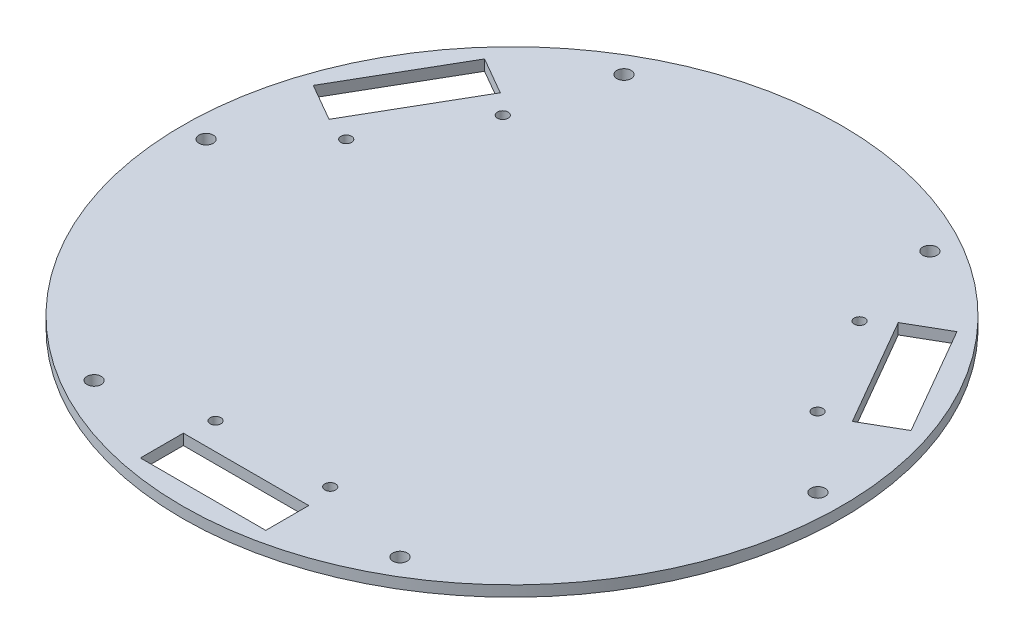
ISO-10303-21;
HEADER;
FILE_DESCRIPTION(('STEP AP214'),'2;1');
FILE_NAME('part.step','',(''),(''),'','','');
FILE_SCHEMA(('AUTOMOTIVE_DESIGN { 1 0 10303 214 1 1 1 1 }'));
ENDSEC;
DATA;
#1=APPLICATION_CONTEXT('core data for automotive mechanical design processes');
#2=APPLICATION_PROTOCOL_DEFINITION('international standard','automotive_design',2000,#1);
#3=PRODUCT_CONTEXT('',#1,'mechanical');
#4=PRODUCT('Part','Part','',(#3));
#5=PRODUCT_RELATED_PRODUCT_CATEGORY('part','',(#4));
#6=PRODUCT_DEFINITION_FORMATION('','',#4);
#7=PRODUCT_DEFINITION_CONTEXT('part definition',#1,'design');
#8=PRODUCT_DEFINITION('design','',#6,#7);
#9=PRODUCT_DEFINITION_SHAPE('','',#8);
#10=(LENGTH_UNIT() NAMED_UNIT(*) SI_UNIT(.MILLI.,.METRE.));
#11=(NAMED_UNIT(*) PLANE_ANGLE_UNIT() SI_UNIT($,.RADIAN.));
#12=(NAMED_UNIT(*) SI_UNIT($,.STERADIAN.) SOLID_ANGLE_UNIT());
#13=UNCERTAINTY_MEASURE_WITH_UNIT(LENGTH_MEASURE(1.E-05),#10,'distance_accuracy_value','');
#14=(GEOMETRIC_REPRESENTATION_CONTEXT(3) GLOBAL_UNCERTAINTY_ASSIGNED_CONTEXT((#13)) GLOBAL_UNIT_ASSIGNED_CONTEXT((#10,
#11,#12)) REPRESENTATION_CONTEXT('',''));
#15=CARTESIAN_POINT('',(0.,0.,0.));
#16=DIRECTION('',(0.,0.,1.));
#17=DIRECTION('',(1.,0.,0.));
#18=AXIS2_PLACEMENT_3D('',#15,#16,#17);
#19=CARTESIAN_POINT('',(0.,16.5,0.));
#20=DIRECTION('',(0.,-1.,0.));
#21=DIRECTION('',(0.,0.,1.));
#22=AXIS2_PLACEMENT_3D('',#19,#20,#21);
#23=PLANE('',#22);
#24=CARTESIAN_POINT('',(-65.8006060882167,16.5,-19.5147890238048));
#25=DIRECTION('',(0.,1.,0.));
#26=DIRECTION('',(-0.866025403784436,0.,-0.500000000000004));
#27=AXIS2_PLACEMENT_3D('',#24,#25,#26);
#28=CIRCLE('',#27,1.5);
#29=CARTESIAN_POINT('',(-67.0996441938934,16.5,-20.2647890238048));
#30=VERTEX_POINT('',#29);
#31=EDGE_CURVE('E652',#30,#30,#28,.T.);
#32=ORIENTED_EDGE('',*,*,#31,.F.);
#33=EDGE_LOOP('',(#32));
#34=FACE_BOUND('',#33,.T.);
#35=CARTESIAN_POINT('',(49.8006060882172,16.5,-47.227601944906));
#36=DIRECTION('',(0.,1.,0.));
#37=DIRECTION('',(0.866025403784443,0.,-0.499999999999992));
#38=AXIS2_PLACEMENT_3D('',#35,#36,#37);
#39=CIRCLE('',#38,1.5);
#40=CARTESIAN_POINT('',(51.0996441938939,16.5,-47.977601944906));
#41=VERTEX_POINT('',#40);
#42=EDGE_CURVE('E658',#41,#41,#39,.T.);
#43=ORIENTED_EDGE('',*,*,#42,.F.);
#44=EDGE_LOOP('',(#43));
#45=FACE_BOUND('',#44,.T.);
#46=CARTESIAN_POINT('',(-49.8006060882166,16.5,-47.2276019449068));
#47=DIRECTION('',(0.,1.,0.));
#48=DIRECTION('',(-0.866025403784436,0.,-0.500000000000004));
#49=AXIS2_PLACEMENT_3D('',#46,#47,#48);
#50=CIRCLE('',#49,1.5);
#51=CARTESIAN_POINT('',(-51.0996441938933,16.5,-47.9776019449068));
#52=VERTEX_POINT('',#51);
#53=EDGE_CURVE('E173',#52,#52,#50,.T.);
#54=ORIENTED_EDGE('',*,*,#53,.F.);
#55=EDGE_LOOP('',(#54));
#56=FACE_BOUND('',#55,.T.);
#57=CARTESIAN_POINT('',(65.800606088217,16.5,-19.5147890238039));
#58=DIRECTION('',(0.,1.,0.));
#59=DIRECTION('',(0.866025403784443,0.,-0.499999999999992));
#60=AXIS2_PLACEMENT_3D('',#57,#58,#59);
#61=CIRCLE('',#60,1.5);
#62=CARTESIAN_POINT('',(67.0996441938937,16.5,-20.2647890238039));
#63=VERTEX_POINT('',#62);
#64=EDGE_CURVE('E656',#63,#63,#61,.T.);
#65=ORIENTED_EDGE('',*,*,#64,.F.);
#66=EDGE_LOOP('',(#65));
#67=FACE_BOUND('',#66,.T.);
#68=DIRECTION('',(0.499999999999992,0.,0.866025403784443));
#69=VECTOR('',#68,1.);
#70=CARTESIAN_POINT('',(55.5457966166006,16.5,-52.2766400505827));
#71=LINE('',#70,#69);
#72=CARTESIAN_POINT('',(55.5457966166006,16.5,-52.2766400505827));
#73=VERTEX_POINT('',#72);
#74=CARTESIAN_POINT('',(73.0457966166003,16.5,-21.9657509181271));
#75=VERTEX_POINT('',#74);
#76=EDGE_CURVE('E195',#73,#75,#71,.T.);
#77=ORIENTED_EDGE('',*,*,#76,.F.);
#78=DIRECTION('',(0.866025403784443,0.,-0.499999999999992));
#79=VECTOR('',#78,1.);
#80=CARTESIAN_POINT('',(55.5457966166006,16.5,-52.2766400505827));
#81=LINE('',#80,#79);
#82=CARTESIAN_POINT('',(65.9381014620139,16.5,-58.2766400505826));
#83=VERTEX_POINT('',#82);
#84=EDGE_CURVE('E172',#73,#83,#81,.T.);
#85=ORIENTED_EDGE('',*,*,#84,.T.);
#86=DIRECTION('',(0.499999999999992,0.,0.866025403784443));
#87=VECTOR('',#86,1.);
#88=CARTESIAN_POINT('',(65.9381014620139,16.5,-58.2766400505826));
#89=LINE('',#88,#87);
#90=CARTESIAN_POINT('',(83.4381014620136,16.5,-27.965750918127));
#91=VERTEX_POINT('',#90);
#92=EDGE_CURVE('E64',#83,#91,#89,.T.);
#93=ORIENTED_EDGE('',*,*,#92,.T.);
#94=DIRECTION('',(0.866025403784443,0.,-0.499999999999992));
#95=VECTOR('',#94,1.);
#96=CARTESIAN_POINT('',(73.0457966166003,16.5,-21.9657509181271));
#97=LINE('',#96,#95);
#98=EDGE_CURVE('E189',#75,#91,#97,.T.);
#99=ORIENTED_EDGE('',*,*,#98,.F.);
#100=EDGE_LOOP('',(#77,#85,#93,#99));
#101=FACE_BOUND('',#100,.T.);
#102=CARTESIAN_POINT('',(-16.,16.5,66.742390968711));
#103=DIRECTION('',(0.,1.,0.));
#104=DIRECTION('',(0.,0.,1.));
#105=AXIS2_PLACEMENT_3D('',#102,#103,#104);
#106=CIRCLE('',#105,1.5);
#107=CARTESIAN_POINT('',(-16.,16.5,68.242390968711));
#108=VERTEX_POINT('',#107);
#109=EDGE_CURVE('E200',#108,#108,#106,.T.);
#110=ORIENTED_EDGE('',*,*,#109,.F.);
#111=EDGE_LOOP('',(#110));
#112=FACE_BOUND('',#111,.T.);
#113=CARTESIAN_POINT('',(16.,16.5,66.742390968711));
#114=DIRECTION('',(0.,1.,0.));
#115=DIRECTION('',(0.,0.,1.));
#116=AXIS2_PLACEMENT_3D('',#113,#114,#115);
#117=CIRCLE('',#116,1.5);
#118=CARTESIAN_POINT('',(16.,16.5,68.242390968711));
#119=VERTEX_POINT('',#118);
#120=EDGE_CURVE('E169',#119,#119,#117,.T.);
#121=ORIENTED_EDGE('',*,*,#120,.F.);
#122=EDGE_LOOP('',(#121));
#123=FACE_BOUND('',#122,.T.);
#124=CARTESIAN_POINT('',(0.,16.5,0.));
#125=DIRECTION('',(0.,1.,0.));
#126=DIRECTION('',(0.,0.,1.));
#127=AXIS2_PLACEMENT_3D('',#124,#125,#126);
#128=CIRCLE('',#127,92.);
#129=CARTESIAN_POINT('',(0.,16.5,92.));
#130=VERTEX_POINT('',#129);
#131=EDGE_CURVE('E264',#130,#130,#128,.T.);
#132=ORIENTED_EDGE('',*,*,#131,.T.);
#133=EDGE_LOOP('',(#132));
#134=FACE_BOUND('',#133,.T.);
#135=CARTESIAN_POINT('',(-42.7,16.5,-73.9585694831911));
#136=DIRECTION('',(0.,1.,0.));
#137=DIRECTION('',(0.,0.,1.));
#138=AXIS2_PLACEMENT_3D('',#135,#136,#137);
#139=CIRCLE('',#138,2.);
#140=CARTESIAN_POINT('',(-42.7,16.5,-71.9585694831911));
#141=VERTEX_POINT('',#140);
#142=EDGE_CURVE('E258',#141,#141,#139,.T.);
#143=ORIENTED_EDGE('',*,*,#142,.F.);
#144=EDGE_LOOP('',(#143));
#145=FACE_BOUND('',#144,.T.);
#146=CARTESIAN_POINT('',(-85.4,16.5,0.));
#147=DIRECTION('',(0.,1.,0.));
#148=DIRECTION('',(0.,0.,1.));
#149=AXIS2_PLACEMENT_3D('',#146,#147,#148);
#150=CIRCLE('',#149,2.);
#151=CARTESIAN_POINT('',(-85.4,16.5,2.00000000000004));
#152=VERTEX_POINT('',#151);
#153=EDGE_CURVE('E252',#152,#152,#150,.T.);
#154=ORIENTED_EDGE('',*,*,#153,.F.);
#155=EDGE_LOOP('',(#154));
#156=FACE_BOUND('',#155,.T.);
#157=CARTESIAN_POINT('',(-42.7,16.5,73.9585694831911));
#158=DIRECTION('',(0.,1.,0.));
#159=DIRECTION('',(0.,0.,1.));
#160=AXIS2_PLACEMENT_3D('',#157,#158,#159);
#161=CIRCLE('',#160,2.);
#162=CARTESIAN_POINT('',(-42.7,16.5,75.9585694831911));
#163=VERTEX_POINT('',#162);
#164=EDGE_CURVE('E246',#163,#163,#161,.T.);
#165=ORIENTED_EDGE('',*,*,#164,.F.);
#166=EDGE_LOOP('',(#165));
#167=FACE_BOUND('',#166,.T.);
#168=CARTESIAN_POINT('',(42.7,16.5,-73.9585694831911));
#169=DIRECTION('',(0.,1.,0.));
#170=DIRECTION('',(0.,0.,1.));
#171=AXIS2_PLACEMENT_3D('',#168,#169,#170);
#172=CIRCLE('',#171,2.);
#173=CARTESIAN_POINT('',(42.7,16.5,-71.9585694831911));
#174=VERTEX_POINT('',#173);
#175=EDGE_CURVE('E240',#174,#174,#172,.T.);
#176=ORIENTED_EDGE('',*,*,#175,.F.);
#177=EDGE_LOOP('',(#176));
#178=FACE_BOUND('',#177,.T.);
#179=CARTESIAN_POINT('',(85.4,16.5,0.));
#180=DIRECTION('',(0.,1.,0.));
#181=DIRECTION('',(0.,0.,1.));
#182=AXIS2_PLACEMENT_3D('',#179,#180,#181);
#183=CIRCLE('',#182,2.);
#184=CARTESIAN_POINT('',(85.4,16.5,1.99999999999994));
#185=VERTEX_POINT('',#184);
#186=EDGE_CURVE('E234',#185,#185,#183,.T.);
#187=ORIENTED_EDGE('',*,*,#186,.F.);
#188=EDGE_LOOP('',(#187));
#189=FACE_BOUND('',#188,.T.);
#190=CARTESIAN_POINT('',(42.7,16.5,73.9585694831911));
#191=DIRECTION('',(0.,1.,0.));
#192=DIRECTION('',(0.,0.,1.));
#193=AXIS2_PLACEMENT_3D('',#190,#191,#192);
#194=CIRCLE('',#193,2.);
#195=CARTESIAN_POINT('',(42.7,16.5,75.9585694831911));
#196=VERTEX_POINT('',#195);
#197=EDGE_CURVE('E228',#196,#196,#194,.T.);
#198=ORIENTED_EDGE('',*,*,#197,.F.);
#199=EDGE_LOOP('',(#198));
#200=FACE_BOUND('',#199,.T.);
#201=DIRECTION('',(-1.,0.,0.));
#202=VECTOR('',#201,1.);
#203=CARTESIAN_POINT('',(17.5,16.5,74.242390968711));
#204=LINE('',#203,#202);
#205=CARTESIAN_POINT('',(17.5,16.5,74.242390968711));
#206=VERTEX_POINT('',#205);
#207=CARTESIAN_POINT('',(-17.5,16.5,74.242390968711));
#208=VERTEX_POINT('',#207);
#209=EDGE_CURVE('E206',#206,#208,#204,.T.);
#210=ORIENTED_EDGE('',*,*,#209,.F.);
#211=DIRECTION('',(0.,0.,1.));
#212=VECTOR('',#211,1.);
#213=CARTESIAN_POINT('',(17.5,16.5,74.242390968711));
#214=LINE('',#213,#212);
#215=CARTESIAN_POINT('',(17.5,16.5,86.242390968711));
#216=VERTEX_POINT('',#215);
#217=EDGE_CURVE('E213',#206,#216,#214,.T.);
#218=ORIENTED_EDGE('',*,*,#217,.T.);
#219=DIRECTION('',(-1.,0.,0.));
#220=VECTOR('',#219,1.);
#221=CARTESIAN_POINT('',(17.5,16.5,86.242390968711));
#222=LINE('',#221,#220);
#223=CARTESIAN_POINT('',(-17.5,16.5,86.242390968711));
#224=VERTEX_POINT('',#223);
#225=EDGE_CURVE('E210',#216,#224,#222,.T.);
#226=ORIENTED_EDGE('',*,*,#225,.T.);
#227=DIRECTION('',(0.,0.,1.));
#228=VECTOR('',#227,1.);
#229=CARTESIAN_POINT('',(-17.5,16.5,74.242390968711));
#230=LINE('',#229,#228);
#231=EDGE_CURVE('E208',#208,#224,#230,.T.);
#232=ORIENTED_EDGE('',*,*,#231,.F.);
#233=EDGE_LOOP('',(#210,#218,#226,#232));
#234=FACE_BOUND('',#233,.T.);
#235=DIRECTION('',(0.500000000000004,0.,-0.866025403784436));
#236=VECTOR('',#235,1.);
#237=CARTESIAN_POINT('',(-73.0457966166,16.5,-21.9657509181281));
#238=LINE('',#237,#236);
#239=CARTESIAN_POINT('',(-73.0457966166,16.5,-21.9657509181281));
#240=VERTEX_POINT('',#239);
#241=CARTESIAN_POINT('',(-55.5457966165999,16.5,-52.2766400505834));
#242=VERTEX_POINT('',#241);
#243=EDGE_CURVE('E164',#240,#242,#238,.T.);
#244=ORIENTED_EDGE('',*,*,#243,.F.);
#245=DIRECTION('',(-0.866025403784436,0.,-0.500000000000004));
#246=VECTOR('',#245,1.);
#247=CARTESIAN_POINT('',(-73.0457966166,16.5,-21.9657509181281));
#248=LINE('',#247,#246);
#249=CARTESIAN_POINT('',(-83.4381014620133,16.5,-27.9657509181282));
#250=VERTEX_POINT('',#249);
#251=EDGE_CURVE('E141',#240,#250,#248,.T.);
#252=ORIENTED_EDGE('',*,*,#251,.T.);
#253=DIRECTION('',(0.500000000000004,0.,-0.866025403784436));
#254=VECTOR('',#253,1.);
#255=CARTESIAN_POINT('',(-83.4381014620132,16.5,-27.9657509181282));
#256=LINE('',#255,#254);
#257=CARTESIAN_POINT('',(-65.9381014620131,16.5,-58.2766400505835));
#258=VERTEX_POINT('',#257);
#259=EDGE_CURVE('E56',#250,#258,#256,.T.);
#260=ORIENTED_EDGE('',*,*,#259,.T.);
#261=DIRECTION('',(-0.866025403784437,0.,-0.500000000000004));
#262=VECTOR('',#261,1.);
#263=CARTESIAN_POINT('',(-55.5457966165999,16.5,-52.2766400505834));
#264=LINE('',#263,#262);
#265=EDGE_CURVE('E160',#242,#258,#264,.T.);
#266=ORIENTED_EDGE('',*,*,#265,.F.);
#267=EDGE_LOOP('',(#244,#252,#260,#266));
#268=FACE_BOUND('',#267,.T.);
#269=ADVANCED_FACE('F39',(#34,#45,#56,#67,#101,#112,#123,#134,#145,#156,#167,#178,#189,#200,
#234,#268),#23,.F.);
#270=CARTESIAN_POINT('',(0.,13.5,0.));
#271=DIRECTION('',(0.,-1.,0.));
#272=DIRECTION('',(0.,0.,1.));
#273=AXIS2_PLACEMENT_3D('',#270,#271,#272);
#274=PLANE('',#273);
#275=CARTESIAN_POINT('',(-65.8006060882167,13.5,-19.5147890238048));
#276=DIRECTION('',(0.,-1.,0.));
#277=DIRECTION('',(0.866025403784436,0.,0.500000000000004));
#278=AXIS2_PLACEMENT_3D('',#275,#276,#277);
#279=CIRCLE('',#278,1.5);
#280=CARTESIAN_POINT('',(-64.5015679825401,13.5,-18.7647890238048));
#281=VERTEX_POINT('',#280);
#282=EDGE_CURVE('E650',#281,#281,#279,.T.);
#283=ORIENTED_EDGE('',*,*,#282,.F.);
#284=EDGE_LOOP('',(#283));
#285=FACE_BOUND('',#284,.T.);
#286=CARTESIAN_POINT('',(49.8006060882172,13.5,-47.227601944906));
#287=DIRECTION('',(0.,-1.,0.));
#288=DIRECTION('',(-0.866025403784443,0.,0.499999999999992));
#289=AXIS2_PLACEMENT_3D('',#286,#287,#288);
#290=CIRCLE('',#289,1.5);
#291=CARTESIAN_POINT('',(48.5015679825406,13.5,-46.4776019449061));
#292=VERTEX_POINT('',#291);
#293=EDGE_CURVE('E661',#292,#292,#290,.T.);
#294=ORIENTED_EDGE('',*,*,#293,.F.);
#295=EDGE_LOOP('',(#294));
#296=FACE_BOUND('',#295,.T.);
#297=CARTESIAN_POINT('',(-49.8006060882166,13.5,-47.2276019449068));
#298=DIRECTION('',(0.,-1.,0.));
#299=DIRECTION('',(0.866025403784436,0.,0.500000000000004));
#300=AXIS2_PLACEMENT_3D('',#297,#298,#299);
#301=CIRCLE('',#300,1.5);
#302=CARTESIAN_POINT('',(-48.5015679825399,13.5,-46.4776019449068));
#303=VERTEX_POINT('',#302);
#304=EDGE_CURVE('E666',#303,#303,#301,.T.);
#305=ORIENTED_EDGE('',*,*,#304,.F.);
#306=EDGE_LOOP('',(#305));
#307=FACE_BOUND('',#306,.T.);
#308=CARTESIAN_POINT('',(65.800606088217,13.5,-19.5147890238039));
#309=DIRECTION('',(0.,-1.,0.));
#310=DIRECTION('',(-0.866025403784443,0.,0.499999999999992));
#311=AXIS2_PLACEMENT_3D('',#308,#309,#310);
#312=CIRCLE('',#311,1.5);
#313=CARTESIAN_POINT('',(64.5015679825403,13.5,-18.7647890238039));
#314=VERTEX_POINT('',#313);
#315=EDGE_CURVE('E653',#314,#314,#312,.T.);
#316=ORIENTED_EDGE('',*,*,#315,.F.);
#317=EDGE_LOOP('',(#316));
#318=FACE_BOUND('',#317,.T.);
#319=CARTESIAN_POINT('',(-16.,13.5,66.742390968711));
#320=DIRECTION('',(0.,-1.,0.));
#321=DIRECTION('',(0.,0.,-1.));
#322=AXIS2_PLACEMENT_3D('',#319,#320,#321);
#323=CIRCLE('',#322,1.5);
#324=CARTESIAN_POINT('',(-16.,13.5,65.242390968711));
#325=VERTEX_POINT('',#324);
#326=EDGE_CURVE('E43',#325,#325,#323,.T.);
#327=ORIENTED_EDGE('',*,*,#326,.F.);
#328=EDGE_LOOP('',(#327));
#329=FACE_BOUND('',#328,.T.);
#330=CARTESIAN_POINT('',(16.,13.5,66.742390968711));
#331=DIRECTION('',(0.,-1.,0.));
#332=DIRECTION('',(0.,0.,-1.));
#333=AXIS2_PLACEMENT_3D('',#330,#331,#332);
#334=CIRCLE('',#333,1.5);
#335=CARTESIAN_POINT('',(16.,13.5,65.242390968711));
#336=VERTEX_POINT('',#335);
#337=EDGE_CURVE('E203',#336,#336,#334,.T.);
#338=ORIENTED_EDGE('',*,*,#337,.F.);
#339=EDGE_LOOP('',(#338));
#340=FACE_BOUND('',#339,.T.);
#341=CARTESIAN_POINT('',(42.7,13.5,73.9585694831911));
#342=DIRECTION('',(0.,1.,0.));
#343=DIRECTION('',(0.,0.,1.));
#344=AXIS2_PLACEMENT_3D('',#341,#342,#343);
#345=CIRCLE('',#344,2.);
#346=CARTESIAN_POINT('',(42.7,13.5,75.9585694831911));
#347=VERTEX_POINT('',#346);
#348=EDGE_CURVE('E227',#347,#347,#345,.T.);
#349=ORIENTED_EDGE('',*,*,#348,.T.);
#350=EDGE_LOOP('',(#349));
#351=FACE_BOUND('',#350,.T.);
#352=CARTESIAN_POINT('',(85.4,13.5,0.));
#353=DIRECTION('',(0.,1.,0.));
#354=DIRECTION('',(0.,0.,1.));
#355=AXIS2_PLACEMENT_3D('',#352,#353,#354);
#356=CIRCLE('',#355,2.);
#357=CARTESIAN_POINT('',(85.4,13.5,1.99999999999994));
#358=VERTEX_POINT('',#357);
#359=EDGE_CURVE('E231',#358,#358,#356,.T.);
#360=ORIENTED_EDGE('',*,*,#359,.T.);
#361=EDGE_LOOP('',(#360));
#362=FACE_BOUND('',#361,.T.);
#363=CARTESIAN_POINT('',(42.7,13.5,-73.9585694831911));
#364=DIRECTION('',(0.,1.,0.));
#365=DIRECTION('',(0.,0.,1.));
#366=AXIS2_PLACEMENT_3D('',#363,#364,#365);
#367=CIRCLE('',#366,2.);
#368=CARTESIAN_POINT('',(42.7,13.5,-71.9585694831911));
#369=VERTEX_POINT('',#368);
#370=EDGE_CURVE('E237',#369,#369,#367,.T.);
#371=ORIENTED_EDGE('',*,*,#370,.T.);
#372=EDGE_LOOP('',(#371));
#373=FACE_BOUND('',#372,.T.);
#374=CARTESIAN_POINT('',(-42.7,13.5,73.9585694831911));
#375=DIRECTION('',(0.,1.,0.));
#376=DIRECTION('',(0.,0.,1.));
#377=AXIS2_PLACEMENT_3D('',#374,#375,#376);
#378=CIRCLE('',#377,2.);
#379=CARTESIAN_POINT('',(-42.7,13.5,75.9585694831911));
#380=VERTEX_POINT('',#379);
#381=EDGE_CURVE('E243',#380,#380,#378,.T.);
#382=ORIENTED_EDGE('',*,*,#381,.T.);
#383=EDGE_LOOP('',(#382));
#384=FACE_BOUND('',#383,.T.);
#385=CARTESIAN_POINT('',(-85.4,13.5,0.));
#386=DIRECTION('',(0.,1.,0.));
#387=DIRECTION('',(0.,0.,1.));
#388=AXIS2_PLACEMENT_3D('',#385,#386,#387);
#389=CIRCLE('',#388,2.);
#390=CARTESIAN_POINT('',(-85.4,13.5,2.00000000000004));
#391=VERTEX_POINT('',#390);
#392=EDGE_CURVE('E249',#391,#391,#389,.T.);
#393=ORIENTED_EDGE('',*,*,#392,.T.);
#394=EDGE_LOOP('',(#393));
#395=FACE_BOUND('',#394,.T.);
#396=CARTESIAN_POINT('',(-42.7,13.5,-73.9585694831911));
#397=DIRECTION('',(0.,1.,0.));
#398=DIRECTION('',(0.,0.,1.));
#399=AXIS2_PLACEMENT_3D('',#396,#397,#398);
#400=CIRCLE('',#399,2.);
#401=CARTESIAN_POINT('',(-42.7,13.5,-71.9585694831911));
#402=VERTEX_POINT('',#401);
#403=EDGE_CURVE('E255',#402,#402,#400,.T.);
#404=ORIENTED_EDGE('',*,*,#403,.T.);
#405=EDGE_LOOP('',(#404));
#406=FACE_BOUND('',#405,.T.);
#407=CARTESIAN_POINT('',(0.,13.5,0.));
#408=DIRECTION('',(0.,1.,0.));
#409=DIRECTION('',(0.,0.,1.));
#410=AXIS2_PLACEMENT_3D('',#407,#408,#409);
#411=CIRCLE('',#410,92.);
#412=CARTESIAN_POINT('',(0.,13.5,92.));
#413=VERTEX_POINT('',#412);
#414=EDGE_CURVE('E261',#413,#413,#411,.T.);
#415=ORIENTED_EDGE('',*,*,#414,.F.);
#416=EDGE_LOOP('',(#415));
#417=FACE_BOUND('',#416,.T.);
#418=DIRECTION('',(0.,0.,1.));
#419=VECTOR('',#418,1.);
#420=CARTESIAN_POINT('',(17.5,13.5,0.));
#421=LINE('',#420,#419);
#422=CARTESIAN_POINT('',(17.5,13.5,74.242390968711));
#423=VERTEX_POINT('',#422);
#424=CARTESIAN_POINT('',(17.5,13.5,86.242390968711));
#425=VERTEX_POINT('',#424);
#426=EDGE_CURVE('E267',#423,#425,#421,.T.);
#427=ORIENTED_EDGE('',*,*,#426,.F.);
#428=DIRECTION('',(-1.,0.,0.));
#429=VECTOR('',#428,1.);
#430=CARTESIAN_POINT('',(0.,13.5,74.242390968711));
#431=LINE('',#430,#429);
#432=CARTESIAN_POINT('',(-17.5,13.5,74.242390968711));
#433=VERTEX_POINT('',#432);
#434=EDGE_CURVE('E11',#423,#433,#431,.T.);
#435=ORIENTED_EDGE('',*,*,#434,.T.);
#436=DIRECTION('',(0.,0.,1.));
#437=VECTOR('',#436,1.);
#438=CARTESIAN_POINT('',(-17.5,13.5,0.));
#439=LINE('',#438,#437);
#440=CARTESIAN_POINT('',(-17.5,13.5,86.242390968711));
#441=VERTEX_POINT('',#440);
#442=EDGE_CURVE('E48',#433,#441,#439,.T.);
#443=ORIENTED_EDGE('',*,*,#442,.T.);
#444=DIRECTION('',(-1.,0.,0.));
#445=VECTOR('',#444,1.);
#446=CARTESIAN_POINT('',(0.,13.5,86.242390968711));
#447=LINE('',#446,#445);
#448=EDGE_CURVE('E271',#425,#441,#447,.T.);
#449=ORIENTED_EDGE('',*,*,#448,.F.);
#450=EDGE_LOOP('',(#427,#435,#443,#449));
#451=FACE_BOUND('',#450,.T.);
#452=DIRECTION('',(0.866025403784443,0.,-0.499999999999992));
#453=VECTOR('',#452,1.);
#454=CARTESIAN_POINT('',(-8.74999999999986,13.5,-15.1554445662278));
#455=LINE('',#454,#453);
#456=CARTESIAN_POINT('',(55.5457966166005,13.5,-52.2766400505826));
#457=VERTEX_POINT('',#456);
#458=CARTESIAN_POINT('',(65.9381014620139,13.5,-58.2766400505826));
#459=VERTEX_POINT('',#458);
#460=EDGE_CURVE('E170',#457,#459,#455,.T.);
#461=ORIENTED_EDGE('',*,*,#460,.F.);
#462=DIRECTION('',(0.499999999999992,0.,0.866025403784443));
#463=VECTOR('',#462,1.);
#464=CARTESIAN_POINT('',(64.2957966166004,13.5,-37.1211954843549));
#465=LINE('',#464,#463);
#466=CARTESIAN_POINT('',(73.0457966166003,13.5,-21.9657509181271));
#467=VERTEX_POINT('',#466);
#468=EDGE_CURVE('E142',#457,#467,#465,.T.);
#469=ORIENTED_EDGE('',*,*,#468,.T.);
#470=DIRECTION('',(0.866025403784443,0.,-0.499999999999992));
#471=VECTOR('',#470,1.);
#472=CARTESIAN_POINT('',(8.74999999999987,13.5,15.1554445662278));
#473=LINE('',#472,#471);
#474=CARTESIAN_POINT('',(83.4381014620136,13.5,-27.965750918127));
#475=VERTEX_POINT('',#474);
#476=EDGE_CURVE('E192',#467,#475,#473,.T.);
#477=ORIENTED_EDGE('',*,*,#476,.T.);
#478=DIRECTION('',(0.499999999999992,0.,0.866025403784443));
#479=VECTOR('',#478,1.);
#480=CARTESIAN_POINT('',(74.6881014620137,13.5,-43.1211954843548));
#481=LINE('',#480,#479);
#482=EDGE_CURVE('E181',#459,#475,#481,.T.);
#483=ORIENTED_EDGE('',*,*,#482,.F.);
#484=EDGE_LOOP('',(#461,#469,#477,#483));
#485=FACE_BOUND('',#484,.T.);
#486=DIRECTION('',(-0.866025403784436,0.,-0.500000000000004));
#487=VECTOR('',#486,1.);
#488=CARTESIAN_POINT('',(-8.75000000000007,13.5,15.1554445662276));
#489=LINE('',#488,#487);
#490=CARTESIAN_POINT('',(-73.0457966166,13.5,-21.9657509181282));
#491=VERTEX_POINT('',#490);
#492=CARTESIAN_POINT('',(-83.4381014620132,13.5,-27.9657509181282));
#493=VERTEX_POINT('',#492);
#494=EDGE_CURVE('E132',#491,#493,#489,.T.);
#495=ORIENTED_EDGE('',*,*,#494,.F.);
#496=DIRECTION('',(0.500000000000004,0.,-0.866025403784436));
#497=VECTOR('',#496,1.);
#498=CARTESIAN_POINT('',(-64.2957966165999,13.5,-37.1211954843558));
#499=LINE('',#498,#497);
#500=CARTESIAN_POINT('',(-55.5457966165999,13.5,-52.2766400505834));
#501=VERTEX_POINT('',#500);
#502=EDGE_CURVE('E167',#491,#501,#499,.T.);
#503=ORIENTED_EDGE('',*,*,#502,.T.);
#504=DIRECTION('',(-0.866025403784437,0.,-0.500000000000004));
#505=VECTOR('',#504,1.);
#506=CARTESIAN_POINT('',(8.75000000000007,13.5,-15.1554445662277));
#507=LINE('',#506,#505);
#508=CARTESIAN_POINT('',(-65.9381014620131,13.5,-58.2766400505835));
#509=VERTEX_POINT('',#508);
#510=EDGE_CURVE('E151',#501,#509,#507,.T.);
#511=ORIENTED_EDGE('',*,*,#510,.T.);
#512=DIRECTION('',(0.500000000000004,0.,-0.866025403784436));
#513=VECTOR('',#512,1.);
#514=CARTESIAN_POINT('',(-74.6881014620132,13.5,-43.1211954843558));
#515=LINE('',#514,#513);
#516=EDGE_CURVE('E145',#493,#509,#515,.T.);
#517=ORIENTED_EDGE('',*,*,#516,.F.);
#518=EDGE_LOOP('',(#495,#503,#511,#517));
#519=FACE_BOUND('',#518,.T.);
#520=ADVANCED_FACE('F149',(#285,#296,#307,#318,#329,#340,#351,#362,#373,#384,#395,#406,#417,
#451,#485,#519),#274,.T.);
#521=CARTESIAN_POINT('',(0.,16.5,0.));
#522=DIRECTION('',(0.,-1.,0.));
#523=DIRECTION('',(0.,0.,1.));
#524=AXIS2_PLACEMENT_3D('',#521,#522,#523);
#525=CYLINDRICAL_SURFACE('',#524,92.);
#526=ORIENTED_EDGE('',*,*,#131,.F.);
#527=EDGE_LOOP('',(#526));
#528=FACE_BOUND('',#527,.T.);
#529=ORIENTED_EDGE('',*,*,#414,.T.);
#530=EDGE_LOOP('',(#529));
#531=FACE_BOUND('',#530,.T.);
#532=ADVANCED_FACE('F41',(#528,#531),#525,.T.);
#533=CARTESIAN_POINT('',(-42.7,16.5,-73.9585694831911));
#534=DIRECTION('',(0.,-1.,0.));
#535=DIRECTION('',(0.,0.,1.));
#536=AXIS2_PLACEMENT_3D('',#533,#534,#535);
#537=CYLINDRICAL_SURFACE('',#536,2.);
#538=ORIENTED_EDGE('',*,*,#142,.T.);
#539=EDGE_LOOP('',(#538));
#540=FACE_BOUND('',#539,.T.);
#541=ORIENTED_EDGE('',*,*,#403,.F.);
#542=EDGE_LOOP('',(#541));
#543=FACE_BOUND('',#542,.T.);
#544=ADVANCED_FACE('F336',(#540,#543),#537,.F.);
#545=CARTESIAN_POINT('',(-85.4,16.5,0.));
#546=DIRECTION('',(0.,-1.,0.));
#547=DIRECTION('',(0.,0.,1.));
#548=AXIS2_PLACEMENT_3D('',#545,#546,#547);
#549=CYLINDRICAL_SURFACE('',#548,2.);
#550=ORIENTED_EDGE('',*,*,#153,.T.);
#551=EDGE_LOOP('',(#550));
#552=FACE_BOUND('',#551,.T.);
#553=ORIENTED_EDGE('',*,*,#392,.F.);
#554=EDGE_LOOP('',(#553));
#555=FACE_BOUND('',#554,.T.);
#556=ADVANCED_FACE('F339',(#552,#555),#549,.F.);
#557=CARTESIAN_POINT('',(-42.7,16.5,73.9585694831911));
#558=DIRECTION('',(0.,-1.,0.));
#559=DIRECTION('',(0.,0.,1.));
#560=AXIS2_PLACEMENT_3D('',#557,#558,#559);
#561=CYLINDRICAL_SURFACE('',#560,2.);
#562=ORIENTED_EDGE('',*,*,#164,.T.);
#563=EDGE_LOOP('',(#562));
#564=FACE_BOUND('',#563,.T.);
#565=ORIENTED_EDGE('',*,*,#381,.F.);
#566=EDGE_LOOP('',(#565));
#567=FACE_BOUND('',#566,.T.);
#568=ADVANCED_FACE('F343',(#564,#567),#561,.F.);
#569=CARTESIAN_POINT('',(42.7,16.5,-73.9585694831911));
#570=DIRECTION('',(0.,-1.,0.));
#571=DIRECTION('',(0.,0.,1.));
#572=AXIS2_PLACEMENT_3D('',#569,#570,#571);
#573=CYLINDRICAL_SURFACE('',#572,2.);
#574=ORIENTED_EDGE('',*,*,#175,.T.);
#575=EDGE_LOOP('',(#574));
#576=FACE_BOUND('',#575,.T.);
#577=ORIENTED_EDGE('',*,*,#370,.F.);
#578=EDGE_LOOP('',(#577));
#579=FACE_BOUND('',#578,.T.);
#580=ADVANCED_FACE('F347',(#576,#579),#573,.F.);
#581=CARTESIAN_POINT('',(85.4,16.5,0.));
#582=DIRECTION('',(0.,-1.,0.));
#583=DIRECTION('',(0.,0.,1.));
#584=AXIS2_PLACEMENT_3D('',#581,#582,#583);
#585=CYLINDRICAL_SURFACE('',#584,2.);
#586=ORIENTED_EDGE('',*,*,#186,.T.);
#587=EDGE_LOOP('',(#586));
#588=FACE_BOUND('',#587,.T.);
#589=ORIENTED_EDGE('',*,*,#359,.F.);
#590=EDGE_LOOP('',(#589));
#591=FACE_BOUND('',#590,.T.);
#592=ADVANCED_FACE('F351',(#588,#591),#585,.F.);
#593=CARTESIAN_POINT('',(42.7,16.5,73.9585694831911));
#594=DIRECTION('',(0.,-1.,0.));
#595=DIRECTION('',(0.,0.,1.));
#596=AXIS2_PLACEMENT_3D('',#593,#594,#595);
#597=CYLINDRICAL_SURFACE('',#596,2.);
#598=ORIENTED_EDGE('',*,*,#197,.T.);
#599=EDGE_LOOP('',(#598));
#600=FACE_BOUND('',#599,.T.);
#601=ORIENTED_EDGE('',*,*,#348,.F.);
#602=EDGE_LOOP('',(#601));
#603=FACE_BOUND('',#602,.T.);
#604=ADVANCED_FACE('F355',(#600,#603),#597,.F.);
#605=CARTESIAN_POINT('',(17.5,16.5,74.242390968711));
#606=DIRECTION('',(0.,0.,1.));
#607=DIRECTION('',(1.,0.,0.));
#608=AXIS2_PLACEMENT_3D('',#605,#606,#607);
#609=PLANE('',#608);
#610=DIRECTION('',(0.,-1.,0.));
#611=VECTOR('',#610,1.);
#612=CARTESIAN_POINT('',(17.5,16.5,74.242390968711));
#613=LINE('',#612,#611);
#614=EDGE_CURVE('E216',#206,#423,#613,.T.);
#615=ORIENTED_EDGE('',*,*,#614,.F.);
#616=ORIENTED_EDGE('',*,*,#209,.T.);
#617=DIRECTION('',(0.,-1.,0.));
#618=VECTOR('',#617,1.);
#619=CARTESIAN_POINT('',(-17.5,16.5,74.242390968711));
#620=LINE('',#619,#618);
#621=EDGE_CURVE('E224',#208,#433,#620,.T.);
#622=ORIENTED_EDGE('',*,*,#621,.T.);
#623=ORIENTED_EDGE('',*,*,#434,.F.);
#624=EDGE_LOOP('',(#615,#616,#622,#623));
#625=FACE_BOUND('',#624,.T.);
#626=ADVANCED_FACE('F359',(#625),#609,.T.);
#627=CARTESIAN_POINT('',(-17.5,16.5,74.242390968711));
#628=DIRECTION('',(1.,0.,0.));
#629=DIRECTION('',(0.,0.,-1.));
#630=AXIS2_PLACEMENT_3D('',#627,#628,#629);
#631=PLANE('',#630);
#632=ORIENTED_EDGE('',*,*,#621,.F.);
#633=ORIENTED_EDGE('',*,*,#231,.T.);
#634=DIRECTION('',(0.,-1.,0.));
#635=VECTOR('',#634,1.);
#636=CARTESIAN_POINT('',(-17.5,16.5,86.242390968711));
#637=LINE('',#636,#635);
#638=EDGE_CURVE('E221',#224,#441,#637,.T.);
#639=ORIENTED_EDGE('',*,*,#638,.T.);
#640=ORIENTED_EDGE('',*,*,#442,.F.);
#641=EDGE_LOOP('',(#632,#633,#639,#640));
#642=FACE_BOUND('',#641,.T.);
#643=ADVANCED_FACE('F363',(#642),#631,.T.);
#644=CARTESIAN_POINT('',(17.5,16.5,86.242390968711));
#645=DIRECTION('',(0.,0.,1.));
#646=DIRECTION('',(1.,0.,0.));
#647=AXIS2_PLACEMENT_3D('',#644,#645,#646);
#648=PLANE('',#647);
#649=ORIENTED_EDGE('',*,*,#448,.T.);
#650=ORIENTED_EDGE('',*,*,#638,.F.);
#651=ORIENTED_EDGE('',*,*,#225,.F.);
#652=DIRECTION('',(0.,-1.,0.));
#653=VECTOR('',#652,1.);
#654=CARTESIAN_POINT('',(17.5,16.5,86.242390968711));
#655=LINE('',#654,#653);
#656=EDGE_CURVE('E218',#216,#425,#655,.T.);
#657=ORIENTED_EDGE('',*,*,#656,.T.);
#658=EDGE_LOOP('',(#649,#650,#651,#657));
#659=FACE_BOUND('',#658,.T.);
#660=ADVANCED_FACE('F367',(#659),#648,.F.);
#661=CARTESIAN_POINT('',(17.5,16.5,74.242390968711));
#662=DIRECTION('',(1.,0.,0.));
#663=DIRECTION('',(0.,0.,-1.));
#664=AXIS2_PLACEMENT_3D('',#661,#662,#663);
#665=PLANE('',#664);
#666=ORIENTED_EDGE('',*,*,#426,.T.);
#667=ORIENTED_EDGE('',*,*,#656,.F.);
#668=ORIENTED_EDGE('',*,*,#217,.F.);
#669=ORIENTED_EDGE('',*,*,#614,.T.);
#670=EDGE_LOOP('',(#666,#667,#668,#669));
#671=FACE_BOUND('',#670,.T.);
#672=ADVANCED_FACE('F371',(#671),#665,.F.);
#673=CARTESIAN_POINT('',(16.,-16.5,66.742390968711));
#674=DIRECTION('',(0.,1.,0.));
#675=DIRECTION('',(0.,0.,1.));
#676=AXIS2_PLACEMENT_3D('',#673,#674,#675);
#677=CYLINDRICAL_SURFACE('',#676,1.5);
#678=ORIENTED_EDGE('',*,*,#337,.T.);
#679=EDGE_LOOP('',(#678));
#680=FACE_BOUND('',#679,.T.);
#681=ORIENTED_EDGE('',*,*,#120,.T.);
#682=EDGE_LOOP('',(#681));
#683=FACE_BOUND('',#682,.T.);
#684=ADVANCED_FACE('F326',(#680,#683),#677,.F.);
#685=CARTESIAN_POINT('',(-16.,-16.5,66.742390968711));
#686=DIRECTION('',(0.,1.,0.));
#687=DIRECTION('',(0.,0.,1.));
#688=AXIS2_PLACEMENT_3D('',#685,#686,#687);
#689=CYLINDRICAL_SURFACE('',#688,1.5);
#690=ORIENTED_EDGE('',*,*,#326,.T.);
#691=EDGE_LOOP('',(#690));
#692=FACE_BOUND('',#691,.T.);
#693=ORIENTED_EDGE('',*,*,#109,.T.);
#694=EDGE_LOOP('',(#693));
#695=FACE_BOUND('',#694,.T.);
#696=ADVANCED_FACE('F280',(#692,#695),#689,.F.);
#697=CARTESIAN_POINT('',(55.5457966166006,16.5,-52.2766400505827));
#698=DIRECTION('',(0.866025403784443,0.,-0.499999999999992));
#699=DIRECTION('',(-0.499999999999992,0.,-0.866025403784443));
#700=AXIS2_PLACEMENT_3D('',#697,#698,#699);
#701=PLANE('',#700);
#702=DIRECTION('',(0.,-1.,0.));
#703=VECTOR('',#702,1.);
#704=CARTESIAN_POINT('',(55.5457966166006,16.5,-52.2766400505827));
#705=LINE('',#704,#703);
#706=EDGE_CURVE('E178',#73,#457,#705,.T.);
#707=ORIENTED_EDGE('',*,*,#706,.F.);
#708=ORIENTED_EDGE('',*,*,#76,.T.);
#709=DIRECTION('',(0.,-1.,0.));
#710=VECTOR('',#709,1.);
#711=CARTESIAN_POINT('',(73.0457966166003,16.5,-21.9657509181271));
#712=LINE('',#711,#710);
#713=EDGE_CURVE('E187',#75,#467,#712,.T.);
#714=ORIENTED_EDGE('',*,*,#713,.T.);
#715=ORIENTED_EDGE('',*,*,#468,.F.);
#716=EDGE_LOOP('',(#707,#708,#714,#715));
#717=FACE_BOUND('',#716,.T.);
#718=ADVANCED_FACE('F318',(#717),#701,.T.);
#719=CARTESIAN_POINT('',(73.0457966166003,16.5,-21.9657509181271));
#720=DIRECTION('',(-0.499999999999992,0.,-0.866025403784443));
#721=DIRECTION('',(-0.866025403784443,0.,0.499999999999992));
#722=AXIS2_PLACEMENT_3D('',#719,#720,#721);
#723=PLANE('',#722);
#724=ORIENTED_EDGE('',*,*,#713,.F.);
#725=ORIENTED_EDGE('',*,*,#98,.T.);
#726=DIRECTION('',(0.,-1.,0.));
#727=VECTOR('',#726,1.);
#728=CARTESIAN_POINT('',(83.4381014620136,16.5,-27.965750918127));
#729=LINE('',#728,#727);
#730=EDGE_CURVE('E183',#91,#475,#729,.T.);
#731=ORIENTED_EDGE('',*,*,#730,.T.);
#732=ORIENTED_EDGE('',*,*,#476,.F.);
#733=EDGE_LOOP('',(#724,#725,#731,#732));
#734=FACE_BOUND('',#733,.T.);
#735=ADVANCED_FACE('F312',(#734),#723,.T.);
#736=CARTESIAN_POINT('',(65.9381014620139,16.5,-58.2766400505826));
#737=DIRECTION('',(0.866025403784443,0.,-0.499999999999992));
#738=DIRECTION('',(-0.499999999999992,0.,-0.866025403784443));
#739=AXIS2_PLACEMENT_3D('',#736,#737,#738);
#740=PLANE('',#739);
#741=ORIENTED_EDGE('',*,*,#482,.T.);
#742=ORIENTED_EDGE('',*,*,#730,.F.);
#743=ORIENTED_EDGE('',*,*,#92,.F.);
#744=DIRECTION('',(0.,-1.,0.));
#745=VECTOR('',#744,1.);
#746=CARTESIAN_POINT('',(65.9381014620139,16.5,-58.2766400505826));
#747=LINE('',#746,#745);
#748=EDGE_CURVE('E176',#83,#459,#747,.T.);
#749=ORIENTED_EDGE('',*,*,#748,.T.);
#750=EDGE_LOOP('',(#741,#742,#743,#749));
#751=FACE_BOUND('',#750,.T.);
#752=ADVANCED_FACE('F309',(#751),#740,.F.);
#753=CARTESIAN_POINT('',(55.5457966166006,16.5,-52.2766400505827));
#754=DIRECTION('',(-0.499999999999992,0.,-0.866025403784443));
#755=DIRECTION('',(-0.866025403784443,0.,0.499999999999992));
#756=AXIS2_PLACEMENT_3D('',#753,#754,#755);
#757=PLANE('',#756);
#758=ORIENTED_EDGE('',*,*,#460,.T.);
#759=ORIENTED_EDGE('',*,*,#748,.F.);
#760=ORIENTED_EDGE('',*,*,#84,.F.);
#761=ORIENTED_EDGE('',*,*,#706,.T.);
#762=EDGE_LOOP('',(#758,#759,#760,#761));
#763=FACE_BOUND('',#762,.T.);
#764=ADVANCED_FACE('F307',(#763),#757,.F.);
#765=CARTESIAN_POINT('',(-73.0457966166,16.5,-21.9657509181281));
#766=DIRECTION('',(-0.866025403784436,0.,-0.500000000000004));
#767=DIRECTION('',(-0.500000000000004,0.,0.866025403784436));
#768=AXIS2_PLACEMENT_3D('',#765,#766,#767);
#769=PLANE('',#768);
#770=DIRECTION('',(0.,-1.,0.));
#771=VECTOR('',#770,1.);
#772=CARTESIAN_POINT('',(-73.0457966166,16.5,-21.9657509181281));
#773=LINE('',#772,#771);
#774=EDGE_CURVE('E137',#240,#491,#773,.T.);
#775=ORIENTED_EDGE('',*,*,#774,.F.);
#776=ORIENTED_EDGE('',*,*,#243,.T.);
#777=DIRECTION('',(0.,-1.,0.));
#778=VECTOR('',#777,1.);
#779=CARTESIAN_POINT('',(-55.5457966165999,16.5,-52.2766400505834));
#780=LINE('',#779,#778);
#781=EDGE_CURVE('E158',#242,#501,#780,.T.);
#782=ORIENTED_EDGE('',*,*,#781,.T.);
#783=ORIENTED_EDGE('',*,*,#502,.F.);
#784=EDGE_LOOP('',(#775,#776,#782,#783));
#785=FACE_BOUND('',#784,.T.);
#786=ADVANCED_FACE('F403',(#785),#769,.T.);
#787=CARTESIAN_POINT('',(-55.5457966165999,16.5,-52.2766400505834));
#788=DIRECTION('',(-0.500000000000004,0.,0.866025403784437));
#789=DIRECTION('',(0.866025403784437,0.,0.500000000000004));
#790=AXIS2_PLACEMENT_3D('',#787,#788,#789);
#791=PLANE('',#790);
#792=ORIENTED_EDGE('',*,*,#781,.F.);
#793=ORIENTED_EDGE('',*,*,#265,.T.);
#794=DIRECTION('',(0.,-1.,0.));
#795=VECTOR('',#794,1.);
#796=CARTESIAN_POINT('',(-65.9381014620131,16.5,-58.2766400505835));
#797=LINE('',#796,#795);
#798=EDGE_CURVE('E152',#258,#509,#797,.T.);
#799=ORIENTED_EDGE('',*,*,#798,.T.);
#800=ORIENTED_EDGE('',*,*,#510,.F.);
#801=EDGE_LOOP('',(#792,#793,#799,#800));
#802=FACE_BOUND('',#801,.T.);
#803=ADVANCED_FACE('F405',(#802),#791,.T.);
#804=CARTESIAN_POINT('',(-83.4381014620132,16.5,-27.9657509181282));
#805=DIRECTION('',(-0.866025403784436,0.,-0.500000000000004));
#806=DIRECTION('',(-0.500000000000004,0.,0.866025403784436));
#807=AXIS2_PLACEMENT_3D('',#804,#805,#806);
#808=PLANE('',#807);
#809=ORIENTED_EDGE('',*,*,#516,.T.);
#810=ORIENTED_EDGE('',*,*,#798,.F.);
#811=ORIENTED_EDGE('',*,*,#259,.F.);
#812=DIRECTION('',(0.,-1.,0.));
#813=VECTOR('',#812,1.);
#814=CARTESIAN_POINT('',(-83.4381014620132,16.5,-27.9657509181282));
#815=LINE('',#814,#813);
#816=EDGE_CURVE('E134',#250,#493,#815,.T.);
#817=ORIENTED_EDGE('',*,*,#816,.T.);
#818=EDGE_LOOP('',(#809,#810,#811,#817));
#819=FACE_BOUND('',#818,.T.);
#820=ADVANCED_FACE('F144',(#819),#808,.F.);
#821=CARTESIAN_POINT('',(-73.0457966166,16.5,-21.9657509181281));
#822=DIRECTION('',(-0.500000000000004,0.,0.866025403784436));
#823=DIRECTION('',(0.866025403784436,0.,0.500000000000004));
#824=AXIS2_PLACEMENT_3D('',#821,#822,#823);
#825=PLANE('',#824);
#826=ORIENTED_EDGE('',*,*,#494,.T.);
#827=ORIENTED_EDGE('',*,*,#816,.F.);
#828=ORIENTED_EDGE('',*,*,#251,.F.);
#829=ORIENTED_EDGE('',*,*,#774,.T.);
#830=EDGE_LOOP('',(#826,#827,#828,#829));
#831=FACE_BOUND('',#830,.T.);
#832=ADVANCED_FACE('F133',(#831),#825,.F.);
#833=CARTESIAN_POINT('',(65.800606088217,-16.5,-19.5147890238039));
#834=DIRECTION('',(0.,1.,0.));
#835=DIRECTION('',(0.866025403784443,0.,-0.499999999999992));
#836=AXIS2_PLACEMENT_3D('',#833,#834,#835);
#837=CYLINDRICAL_SURFACE('',#836,1.5);
#838=ORIENTED_EDGE('',*,*,#315,.T.);
#839=EDGE_LOOP('',(#838));
#840=FACE_BOUND('',#839,.T.);
#841=ORIENTED_EDGE('',*,*,#64,.T.);
#842=EDGE_LOOP('',(#841));
#843=FACE_BOUND('',#842,.T.);
#844=ADVANCED_FACE('F457',(#840,#843),#837,.F.);
#845=CARTESIAN_POINT('',(-49.8006060882166,-16.5,-47.2276019449068));
#846=DIRECTION('',(0.,1.,0.));
#847=DIRECTION('',(-0.866025403784436,0.,-0.500000000000004));
#848=AXIS2_PLACEMENT_3D('',#845,#846,#847);
#849=CYLINDRICAL_SURFACE('',#848,1.5);
#850=ORIENTED_EDGE('',*,*,#304,.T.);
#851=EDGE_LOOP('',(#850));
#852=FACE_BOUND('',#851,.T.);
#853=ORIENTED_EDGE('',*,*,#53,.T.);
#854=EDGE_LOOP('',(#853));
#855=FACE_BOUND('',#854,.T.);
#856=ADVANCED_FACE('F466',(#852,#855),#849,.F.);
#857=CARTESIAN_POINT('',(49.8006060882172,-16.5,-47.227601944906));
#858=DIRECTION('',(0.,1.,0.));
#859=DIRECTION('',(0.866025403784443,0.,-0.499999999999992));
#860=AXIS2_PLACEMENT_3D('',#857,#858,#859);
#861=CYLINDRICAL_SURFACE('',#860,1.5);
#862=ORIENTED_EDGE('',*,*,#293,.T.);
#863=EDGE_LOOP('',(#862));
#864=FACE_BOUND('',#863,.T.);
#865=ORIENTED_EDGE('',*,*,#42,.T.);
#866=EDGE_LOOP('',(#865));
#867=FACE_BOUND('',#866,.T.);
#868=ADVANCED_FACE('F477',(#864,#867),#861,.F.);
#869=CARTESIAN_POINT('',(-65.8006060882167,-16.5,-19.5147890238048));
#870=DIRECTION('',(0.,1.,0.));
#871=DIRECTION('',(-0.866025403784436,0.,-0.500000000000004));
#872=AXIS2_PLACEMENT_3D('',#869,#870,#871);
#873=CYLINDRICAL_SURFACE('',#872,1.5);
#874=ORIENTED_EDGE('',*,*,#282,.T.);
#875=EDGE_LOOP('',(#874));
#876=FACE_BOUND('',#875,.T.);
#877=ORIENTED_EDGE('',*,*,#31,.T.);
#878=EDGE_LOOP('',(#877));
#879=FACE_BOUND('',#878,.T.);
#880=ADVANCED_FACE('F488',(#876,#879),#873,.F.);
#881=CLOSED_SHELL('',(#269,#520,#532,#544,#556,#568,#580,#592,#604,#626,#643,#660,#672,#684,
#696,#718,#735,#752,#764,#786,#803,#820,#832,#844,#856,#868,#880));
#882=MANIFOLD_SOLID_BREP('B2',#881);
#883=ADVANCED_BREP_SHAPE_REPRESENTATION('',(#18,#882),#14);
#884=SHAPE_DEFINITION_REPRESENTATION(#9,#883);
ENDSEC;
END-ISO-10303-21;
